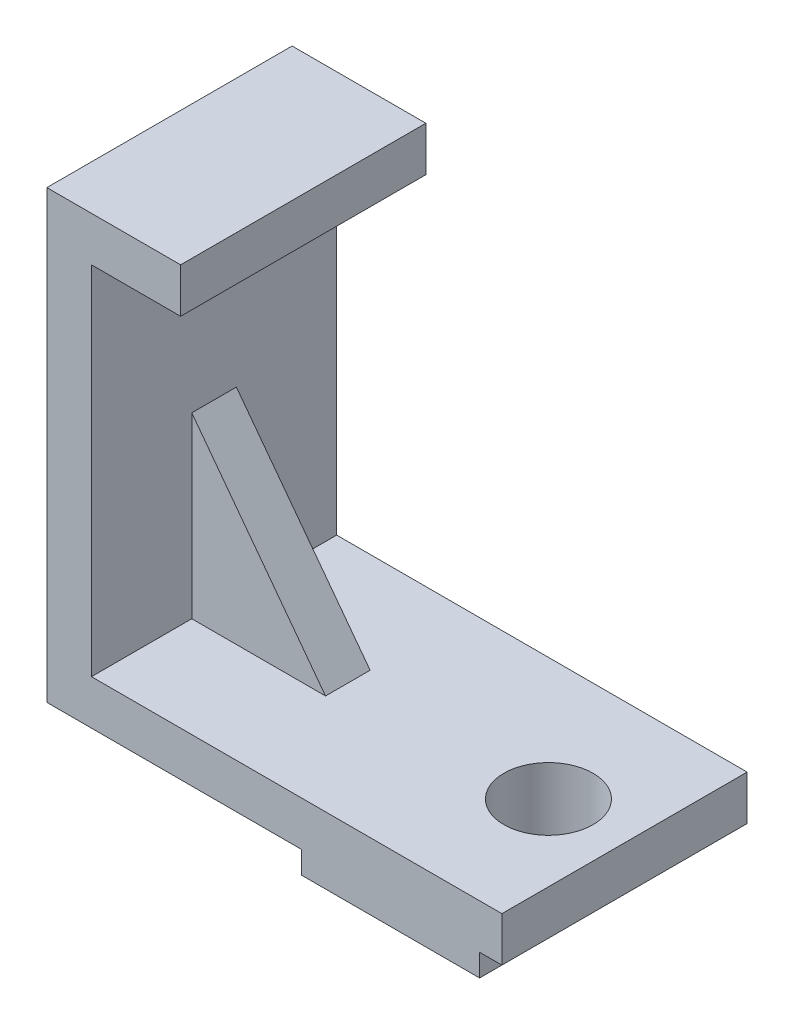
ISO-10303-21;
HEADER;
FILE_DESCRIPTION(('STEP AP214'),'2;1');
FILE_NAME('part.step','',(''),(''),'','','');
FILE_SCHEMA(('AUTOMOTIVE_DESIGN { 1 0 10303 214 1 1 1 1 }'));
ENDSEC;
DATA;
#1=APPLICATION_CONTEXT('core data for automotive mechanical design processes');
#2=APPLICATION_PROTOCOL_DEFINITION('international standard','automotive_design',2000,#1);
#3=PRODUCT_CONTEXT('',#1,'mechanical');
#4=PRODUCT('Part','Part','',(#3));
#5=PRODUCT_RELATED_PRODUCT_CATEGORY('part','',(#4));
#6=PRODUCT_DEFINITION_FORMATION('','',#4);
#7=PRODUCT_DEFINITION_CONTEXT('part definition',#1,'design');
#8=PRODUCT_DEFINITION('design','',#6,#7);
#9=PRODUCT_DEFINITION_SHAPE('','',#8);
#10=(LENGTH_UNIT() NAMED_UNIT(*) SI_UNIT(.MILLI.,.METRE.));
#11=(NAMED_UNIT(*) PLANE_ANGLE_UNIT() SI_UNIT($,.RADIAN.));
#12=(NAMED_UNIT(*) SI_UNIT($,.STERADIAN.) SOLID_ANGLE_UNIT());
#13=UNCERTAINTY_MEASURE_WITH_UNIT(LENGTH_MEASURE(1.E-05),#10,'distance_accuracy_value','');
#14=(GEOMETRIC_REPRESENTATION_CONTEXT(3) GLOBAL_UNCERTAINTY_ASSIGNED_CONTEXT((#13)) GLOBAL_UNIT_ASSIGNED_CONTEXT((#10,
#11,#12)) REPRESENTATION_CONTEXT('',''));
#15=CARTESIAN_POINT('',(0.,0.,0.));
#16=DIRECTION('',(0.,0.,1.));
#17=DIRECTION('',(1.,0.,0.));
#18=AXIS2_PLACEMENT_3D('',#15,#16,#17);
#19=CARTESIAN_POINT('',(-47.0552147239264,21.2576687116564,55.));
#20=DIRECTION('',(0.,1.,0.));
#21=DIRECTION('',(-1.,0.,0.));
#22=AXIS2_PLACEMENT_3D('',#19,#20,#21);
#23=PLANE('',#22);
#24=DIRECTION('',(1.,0.,0.));
#25=VECTOR('',#24,1.);
#26=CARTESIAN_POINT('',(-47.0552147239264,21.2576687116564,0.));
#27=LINE('',#26,#25);
#28=CARTESIAN_POINT('',(-47.0552147239264,21.2576687116564,0.));
#29=VERTEX_POINT('',#28);
#30=CARTESIAN_POINT('',(-27.0552147239264,21.2576687116564,0.));
#31=VERTEX_POINT('',#30);
#32=EDGE_CURVE('E165',#29,#31,#27,.T.);
#33=ORIENTED_EDGE('',*,*,#32,.T.);
#34=DIRECTION('',(0.,0.,-1.));
#35=VECTOR('',#34,1.);
#36=CARTESIAN_POINT('',(-27.0552147239264,21.2576687116564,55.));
#37=LINE('',#36,#35);
#38=CARTESIAN_POINT('',(-27.0552147239264,21.2576687116564,55.));
#39=VERTEX_POINT('',#38);
#40=EDGE_CURVE('E149',#39,#31,#37,.T.);
#41=ORIENTED_EDGE('',*,*,#40,.F.);
#42=DIRECTION('',(1.,0.,0.));
#43=VECTOR('',#42,1.);
#44=CARTESIAN_POINT('',(-47.0552147239264,21.2576687116564,55.));
#45=LINE('',#44,#43);
#46=CARTESIAN_POINT('',(-47.0552147239264,21.2576687116564,55.));
#47=VERTEX_POINT('',#46);
#48=EDGE_CURVE('E166',#47,#39,#45,.T.);
#49=ORIENTED_EDGE('',*,*,#48,.F.);
#50=DIRECTION('',(0.,0.,-1.));
#51=VECTOR('',#50,1.);
#52=CARTESIAN_POINT('',(-47.0552147239264,21.2576687116564,55.));
#53=LINE('',#52,#51);
#54=EDGE_CURVE('E192',#47,#29,#53,.T.);
#55=ORIENTED_EDGE('',*,*,#54,.T.);
#56=EDGE_LOOP('',(#33,#41,#49,#55));
#57=FACE_BOUND('',#56,.T.);
#58=ADVANCED_FACE('F33',(#57),#23,.F.);
#59=CARTESIAN_POINT('',(-27.0552147239264,21.2576687116564,55.));
#60=DIRECTION('',(-1.,0.,0.));
#61=DIRECTION('',(0.,0.,1.));
#62=AXIS2_PLACEMENT_3D('',#59,#60,#61);
#63=PLANE('',#62);
#64=DIRECTION('',(0.,1.,0.));
#65=VECTOR('',#64,1.);
#66=CARTESIAN_POINT('',(-27.0552147239264,21.2576687116564,0.));
#67=LINE('',#66,#65);
#68=CARTESIAN_POINT('',(-27.0552147239264,31.2576687116564,0.));
#69=VERTEX_POINT('',#68);
#70=EDGE_CURVE('E195',#31,#69,#67,.T.);
#71=ORIENTED_EDGE('',*,*,#70,.T.);
#72=DIRECTION('',(0.,0.,-1.));
#73=VECTOR('',#72,1.);
#74=CARTESIAN_POINT('',(-27.0552147239264,31.2576687116564,55.));
#75=LINE('',#74,#73);
#76=CARTESIAN_POINT('',(-27.0552147239264,31.2576687116564,55.));
#77=VERTEX_POINT('',#76);
#78=EDGE_CURVE('E246',#77,#69,#75,.T.);
#79=ORIENTED_EDGE('',*,*,#78,.F.);
#80=DIRECTION('',(0.,1.,0.));
#81=VECTOR('',#80,1.);
#82=CARTESIAN_POINT('',(-27.0552147239264,21.2576687116564,55.));
#83=LINE('',#82,#81);
#84=EDGE_CURVE('E169',#39,#77,#83,.T.);
#85=ORIENTED_EDGE('',*,*,#84,.F.);
#86=ORIENTED_EDGE('',*,*,#40,.T.);
#87=EDGE_LOOP('',(#71,#79,#85,#86));
#88=FACE_BOUND('',#87,.T.);
#89=ADVANCED_FACE('F252',(#88),#63,.F.);
#90=CARTESIAN_POINT('',(-27.0552147239264,31.2576687116564,55.));
#91=DIRECTION('',(0.,-1.,0.));
#92=DIRECTION('',(1.,0.,0.));
#93=AXIS2_PLACEMENT_3D('',#90,#91,#92);
#94=PLANE('',#93);
#95=DIRECTION('',(-1.,0.,0.));
#96=VECTOR('',#95,1.);
#97=CARTESIAN_POINT('',(-27.0552147239264,31.2576687116564,0.));
#98=LINE('',#97,#96);
#99=CARTESIAN_POINT('',(-57.0552147239264,31.2576687116564,0.));
#100=VERTEX_POINT('',#99);
#101=EDGE_CURVE('E197',#69,#100,#98,.T.);
#102=ORIENTED_EDGE('',*,*,#101,.T.);
#103=DIRECTION('',(0.,0.,-1.));
#104=VECTOR('',#103,1.);
#105=CARTESIAN_POINT('',(-57.0552147239264,31.2576687116564,55.));
#106=LINE('',#105,#104);
#107=CARTESIAN_POINT('',(-57.0552147239264,31.2576687116564,55.));
#108=VERTEX_POINT('',#107);
#109=EDGE_CURVE('E243',#108,#100,#106,.T.);
#110=ORIENTED_EDGE('',*,*,#109,.F.);
#111=DIRECTION('',(-1.,0.,0.));
#112=VECTOR('',#111,1.);
#113=CARTESIAN_POINT('',(-27.0552147239264,31.2576687116564,55.));
#114=LINE('',#113,#112);
#115=EDGE_CURVE('E172',#77,#108,#114,.T.);
#116=ORIENTED_EDGE('',*,*,#115,.F.);
#117=ORIENTED_EDGE('',*,*,#78,.T.);
#118=EDGE_LOOP('',(#102,#110,#116,#117));
#119=FACE_BOUND('',#118,.T.);
#120=ADVANCED_FACE('F267',(#119),#94,.F.);
#121=CARTESIAN_POINT('',(-57.0552147239264,31.2576687116564,55.));
#122=DIRECTION('',(1.,0.,0.));
#123=DIRECTION('',(0.,1.,0.));
#124=AXIS2_PLACEMENT_3D('',#121,#122,#123);
#125=PLANE('',#124);
#126=DIRECTION('',(0.,-1.,0.));
#127=VECTOR('',#126,1.);
#128=CARTESIAN_POINT('',(-57.0552147239264,31.2576687116564,0.));
#129=LINE('',#128,#127);
#130=CARTESIAN_POINT('',(-57.0552147239264,-68.7423312883436,0.));
#131=VERTEX_POINT('',#130);
#132=EDGE_CURVE('E199',#100,#131,#129,.T.);
#133=ORIENTED_EDGE('',*,*,#132,.T.);
#134=DIRECTION('',(0.,0.,-1.));
#135=VECTOR('',#134,1.);
#136=CARTESIAN_POINT('',(-57.0552147239264,-68.7423312883436,55.));
#137=LINE('',#136,#135);
#138=CARTESIAN_POINT('',(-57.0552147239264,-68.7423312883436,55.));
#139=VERTEX_POINT('',#138);
#140=EDGE_CURVE('E241',#139,#131,#137,.T.);
#141=ORIENTED_EDGE('',*,*,#140,.F.);
#142=DIRECTION('',(0.,-1.,0.));
#143=VECTOR('',#142,1.);
#144=CARTESIAN_POINT('',(-57.0552147239264,31.2576687116564,55.));
#145=LINE('',#144,#143);
#146=EDGE_CURVE('E174',#108,#139,#145,.T.);
#147=ORIENTED_EDGE('',*,*,#146,.F.);
#148=ORIENTED_EDGE('',*,*,#109,.T.);
#149=EDGE_LOOP('',(#133,#141,#147,#148));
#150=FACE_BOUND('',#149,.T.);
#151=ADVANCED_FACE('F271',(#150),#125,.F.);
#152=CARTESIAN_POINT('',(-57.0552147239264,-68.7423312883436,55.));
#153=DIRECTION('',(0.,1.,0.));
#154=DIRECTION('',(0.,0.,1.));
#155=AXIS2_PLACEMENT_3D('',#152,#153,#154);
#156=PLANE('',#155);
#157=ORIENTED_EDGE('',*,*,#140,.T.);
#158=DIRECTION('',(1.,0.,0.));
#159=VECTOR('',#158,1.);
#160=CARTESIAN_POINT('',(-57.0552147239264,-68.7423312883436,0.));
#161=LINE('',#160,#159);
#162=CARTESIAN_POINT('',(0.,-68.7423312883436,0.));
#163=VERTEX_POINT('',#162);
#164=EDGE_CURVE('E202',#131,#163,#161,.T.);
#165=ORIENTED_EDGE('',*,*,#164,.T.);
#166=DIRECTION('',(0.,0.,-1.));
#167=VECTOR('',#166,1.);
#168=CARTESIAN_POINT('',(0.,-68.7423312883436,55.));
#169=LINE('',#168,#167);
#170=CARTESIAN_POINT('',(0.,-68.7423312883436,55.));
#171=VERTEX_POINT('',#170);
#172=EDGE_CURVE('E238',#171,#163,#169,.T.);
#173=ORIENTED_EDGE('',*,*,#172,.F.);
#174=DIRECTION('',(1.,0.,0.));
#175=VECTOR('',#174,1.);
#176=CARTESIAN_POINT('',(-57.0552147239264,-68.7423312883436,55.));
#177=LINE('',#176,#175);
#178=EDGE_CURVE('E176',#139,#171,#177,.T.);
#179=ORIENTED_EDGE('',*,*,#178,.F.);
#180=EDGE_LOOP('',(#157,#165,#173,#179));
#181=FACE_BOUND('',#180,.T.);
#182=ADVANCED_FACE('F307',(#181),#156,.F.);
#183=CARTESIAN_POINT('',(0.,-68.7423312883436,55.));
#184=DIRECTION('',(1.,0.,0.));
#185=DIRECTION('',(0.,1.,0.));
#186=AXIS2_PLACEMENT_3D('',#183,#184,#185);
#187=PLANE('',#186);
#188=DIRECTION('',(0.,-1.,0.));
#189=VECTOR('',#188,1.);
#190=CARTESIAN_POINT('',(0.,-68.7423312883436,0.));
#191=LINE('',#190,#189);
#192=CARTESIAN_POINT('',(0.,-73.7423312883436,0.));
#193=VERTEX_POINT('',#192);
#194=EDGE_CURVE('E204',#163,#193,#191,.T.);
#195=ORIENTED_EDGE('',*,*,#194,.T.);
#196=DIRECTION('',(0.,0.,-1.));
#197=VECTOR('',#196,1.);
#198=CARTESIAN_POINT('',(0.,-73.7423312883436,55.));
#199=LINE('',#198,#197);
#200=CARTESIAN_POINT('',(0.,-73.7423312883436,55.));
#201=VERTEX_POINT('',#200);
#202=EDGE_CURVE('E235',#201,#193,#199,.T.);
#203=ORIENTED_EDGE('',*,*,#202,.F.);
#204=DIRECTION('',(0.,-1.,0.));
#205=VECTOR('',#204,1.);
#206=CARTESIAN_POINT('',(0.,-68.7423312883436,55.));
#207=LINE('',#206,#205);
#208=EDGE_CURVE('E178',#171,#201,#207,.T.);
#209=ORIENTED_EDGE('',*,*,#208,.F.);
#210=ORIENTED_EDGE('',*,*,#172,.T.);
#211=EDGE_LOOP('',(#195,#203,#209,#210));
#212=FACE_BOUND('',#211,.T.);
#213=ADVANCED_FACE('F305',(#212),#187,.F.);
#214=CARTESIAN_POINT('',(0.,-73.7423312883436,55.));
#215=DIRECTION('',(0.,1.,0.));
#216=DIRECTION('',(0.,0.,1.));
#217=AXIS2_PLACEMENT_3D('',#214,#215,#216);
#218=PLANE('',#217);
#219=CARTESIAN_POINT('',(27.9447852760736,-73.7423312883436,27.5));
#220=DIRECTION('',(0.,1.,0.));
#221=DIRECTION('',(-1.,0.,0.));
#222=AXIS2_PLACEMENT_3D('',#219,#220,#221);
#223=CIRCLE('',#222,10.);
#224=CARTESIAN_POINT('',(17.9447852760736,-73.7423312883436,27.5));
#225=VERTEX_POINT('',#224);
#226=EDGE_CURVE('E153',#225,#225,#223,.T.);
#227=ORIENTED_EDGE('',*,*,#226,.T.);
#228=EDGE_LOOP('',(#227));
#229=FACE_BOUND('',#228,.T.);
#230=DIRECTION('',(1.,0.,0.));
#231=VECTOR('',#230,1.);
#232=CARTESIAN_POINT('',(0.,-73.7423312883436,0.));
#233=LINE('',#232,#231);
#234=CARTESIAN_POINT('',(40.,-73.7423312883436,0.));
#235=VERTEX_POINT('',#234);
#236=EDGE_CURVE('E206',#193,#235,#233,.T.);
#237=ORIENTED_EDGE('',*,*,#236,.T.);
#238=DIRECTION('',(0.,0.,-1.));
#239=VECTOR('',#238,1.);
#240=CARTESIAN_POINT('',(40.,-73.7423312883436,55.));
#241=LINE('',#240,#239);
#242=CARTESIAN_POINT('',(40.,-73.7423312883436,55.));
#243=VERTEX_POINT('',#242);
#244=EDGE_CURVE('E232',#243,#235,#241,.T.);
#245=ORIENTED_EDGE('',*,*,#244,.F.);
#246=DIRECTION('',(1.,0.,0.));
#247=VECTOR('',#246,1.);
#248=CARTESIAN_POINT('',(0.,-73.7423312883436,55.));
#249=LINE('',#248,#247);
#250=EDGE_CURVE('E180',#201,#243,#249,.T.);
#251=ORIENTED_EDGE('',*,*,#250,.F.);
#252=ORIENTED_EDGE('',*,*,#202,.T.);
#253=EDGE_LOOP('',(#237,#245,#251,#252));
#254=FACE_BOUND('',#253,.T.);
#255=ADVANCED_FACE('F300',(#229,#254),#218,.F.);
#256=CARTESIAN_POINT('',(40.,-73.7423312883436,55.));
#257=DIRECTION('',(-1.,0.,0.));
#258=DIRECTION('',(0.,0.,1.));
#259=AXIS2_PLACEMENT_3D('',#256,#257,#258);
#260=PLANE('',#259);
#261=DIRECTION('',(0.,1.,0.));
#262=VECTOR('',#261,1.);
#263=CARTESIAN_POINT('',(40.,-73.7423312883436,0.));
#264=LINE('',#263,#262);
#265=CARTESIAN_POINT('',(40.,-68.7423312883436,0.));
#266=VERTEX_POINT('',#265);
#267=EDGE_CURVE('E208',#235,#266,#264,.T.);
#268=ORIENTED_EDGE('',*,*,#267,.T.);
#269=DIRECTION('',(0.,0.,-1.));
#270=VECTOR('',#269,1.);
#271=CARTESIAN_POINT('',(40.,-68.7423312883436,55.));
#272=LINE('',#271,#270);
#273=CARTESIAN_POINT('',(40.,-68.7423312883436,55.));
#274=VERTEX_POINT('',#273);
#275=EDGE_CURVE('E229',#274,#266,#272,.T.);
#276=ORIENTED_EDGE('',*,*,#275,.F.);
#277=DIRECTION('',(0.,1.,0.));
#278=VECTOR('',#277,1.);
#279=CARTESIAN_POINT('',(40.,-73.7423312883436,55.));
#280=LINE('',#279,#278);
#281=EDGE_CURVE('E182',#243,#274,#280,.T.);
#282=ORIENTED_EDGE('',*,*,#281,.F.);
#283=ORIENTED_EDGE('',*,*,#244,.T.);
#284=EDGE_LOOP('',(#268,#276,#282,#283));
#285=FACE_BOUND('',#284,.T.);
#286=ADVANCED_FACE('F295',(#285),#260,.F.);
#287=CARTESIAN_POINT('',(40.,-68.7423312883436,55.));
#288=DIRECTION('',(0.,1.,0.));
#289=DIRECTION('',(0.,0.,1.));
#290=AXIS2_PLACEMENT_3D('',#287,#288,#289);
#291=PLANE('',#290);
#292=DIRECTION('',(1.,0.,0.));
#293=VECTOR('',#292,1.);
#294=CARTESIAN_POINT('',(40.,-68.7423312883436,0.));
#295=LINE('',#294,#293);
#296=CARTESIAN_POINT('',(45.,-68.7423312883436,0.));
#297=VERTEX_POINT('',#296);
#298=EDGE_CURVE('E210',#266,#297,#295,.T.);
#299=ORIENTED_EDGE('',*,*,#298,.T.);
#300=DIRECTION('',(0.,0.,-1.));
#301=VECTOR('',#300,1.);
#302=CARTESIAN_POINT('',(45.,-68.7423312883436,55.));
#303=LINE('',#302,#301);
#304=CARTESIAN_POINT('',(45.,-68.7423312883436,55.));
#305=VERTEX_POINT('',#304);
#306=EDGE_CURVE('E226',#305,#297,#303,.T.);
#307=ORIENTED_EDGE('',*,*,#306,.F.);
#308=DIRECTION('',(1.,0.,0.));
#309=VECTOR('',#308,1.);
#310=CARTESIAN_POINT('',(40.,-68.7423312883436,55.));
#311=LINE('',#310,#309);
#312=EDGE_CURVE('E184',#274,#305,#311,.T.);
#313=ORIENTED_EDGE('',*,*,#312,.F.);
#314=ORIENTED_EDGE('',*,*,#275,.T.);
#315=EDGE_LOOP('',(#299,#307,#313,#314));
#316=FACE_BOUND('',#315,.T.);
#317=ADVANCED_FACE('F291',(#316),#291,.F.);
#318=CARTESIAN_POINT('',(45.,-68.7423312883436,55.));
#319=DIRECTION('',(-1.,0.,0.));
#320=DIRECTION('',(0.,0.,1.));
#321=AXIS2_PLACEMENT_3D('',#318,#319,#320);
#322=PLANE('',#321);
#323=DIRECTION('',(0.,1.,0.));
#324=VECTOR('',#323,1.);
#325=CARTESIAN_POINT('',(45.,-68.7423312883436,0.));
#326=LINE('',#325,#324);
#327=CARTESIAN_POINT('',(45.,-58.7423312883436,0.));
#328=VERTEX_POINT('',#327);
#329=EDGE_CURVE('E212',#297,#328,#326,.T.);
#330=ORIENTED_EDGE('',*,*,#329,.T.);
#331=DIRECTION('',(0.,0.,-1.));
#332=VECTOR('',#331,1.);
#333=CARTESIAN_POINT('',(45.,-58.7423312883436,55.));
#334=LINE('',#333,#332);
#335=CARTESIAN_POINT('',(45.,-58.7423312883436,55.));
#336=VERTEX_POINT('',#335);
#337=EDGE_CURVE('E223',#336,#328,#334,.T.);
#338=ORIENTED_EDGE('',*,*,#337,.F.);
#339=DIRECTION('',(0.,1.,0.));
#340=VECTOR('',#339,1.);
#341=CARTESIAN_POINT('',(45.,-68.7423312883436,55.));
#342=LINE('',#341,#340);
#343=EDGE_CURVE('E186',#305,#336,#342,.T.);
#344=ORIENTED_EDGE('',*,*,#343,.F.);
#345=ORIENTED_EDGE('',*,*,#306,.T.);
#346=EDGE_LOOP('',(#330,#338,#344,#345));
#347=FACE_BOUND('',#346,.T.);
#348=ADVANCED_FACE('F286',(#347),#322,.F.);
#349=CARTESIAN_POINT('',(45.,-58.7423312883436,55.));
#350=DIRECTION('',(0.,-1.,0.));
#351=DIRECTION('',(1.,0.,0.));
#352=AXIS2_PLACEMENT_3D('',#349,#350,#351);
#353=PLANE('',#352);
#354=CARTESIAN_POINT('',(27.9447852760736,-58.7423312883436,27.5));
#355=DIRECTION('',(0.,1.,0.));
#356=DIRECTION('',(-1.,0.,0.));
#357=AXIS2_PLACEMENT_3D('',#354,#355,#356);
#358=CIRCLE('',#357,10.);
#359=CARTESIAN_POINT('',(17.9447852760736,-58.7423312883436,27.5));
#360=VERTEX_POINT('',#359);
#361=EDGE_CURVE('E157',#360,#360,#358,.T.);
#362=ORIENTED_EDGE('',*,*,#361,.F.);
#363=EDGE_LOOP('',(#362));
#364=FACE_BOUND('',#363,.T.);
#365=DIRECTION('',(0.,0.,-1.));
#366=VECTOR('',#365,1.);
#367=CARTESIAN_POINT('',(-17.0552147239264,-58.7423312883436,55.));
#368=LINE('',#367,#366);
#369=CARTESIAN_POINT('',(-17.0552147239264,-58.7423312883436,22.5));
#370=VERTEX_POINT('',#369);
#371=CARTESIAN_POINT('',(-17.0552147239264,-58.7423312883436,32.5));
#372=VERTEX_POINT('',#371);
#373=EDGE_CURVE('E47',#370,#372,#368,.F.);
#374=ORIENTED_EDGE('',*,*,#373,.T.);
#375=DIRECTION('',(-1.,0.,0.));
#376=VECTOR('',#375,1.);
#377=CARTESIAN_POINT('',(45.,-58.7423312883436,32.5));
#378=LINE('',#377,#376);
#379=CARTESIAN_POINT('',(-47.0552147239264,-58.7423312883436,32.5));
#380=VERTEX_POINT('',#379);
#381=EDGE_CURVE('E162',#372,#380,#378,.T.);
#382=ORIENTED_EDGE('',*,*,#381,.T.);
#383=DIRECTION('',(0.,0.,-1.));
#384=VECTOR('',#383,1.);
#385=CARTESIAN_POINT('',(-47.0552147239264,-58.7423312883436,55.));
#386=LINE('',#385,#384);
#387=CARTESIAN_POINT('',(-47.0552147239264,-58.7423312883436,55.));
#388=VERTEX_POINT('',#387);
#389=EDGE_CURVE('E221',#388,#380,#386,.T.);
#390=ORIENTED_EDGE('',*,*,#389,.F.);
#391=DIRECTION('',(-1.,0.,0.));
#392=VECTOR('',#391,1.);
#393=CARTESIAN_POINT('',(45.,-58.7423312883436,55.));
#394=LINE('',#393,#392);
#395=EDGE_CURVE('E188',#336,#388,#394,.T.);
#396=ORIENTED_EDGE('',*,*,#395,.F.);
#397=ORIENTED_EDGE('',*,*,#337,.T.);
#398=DIRECTION('',(-1.,0.,0.));
#399=VECTOR('',#398,1.);
#400=CARTESIAN_POINT('',(45.,-58.7423312883436,0.));
#401=LINE('',#400,#399);
#402=CARTESIAN_POINT('',(-47.0552147239264,-58.7423312883436,0.));
#403=VERTEX_POINT('',#402);
#404=EDGE_CURVE('E214',#328,#403,#401,.T.);
#405=ORIENTED_EDGE('',*,*,#404,.T.);
#406=CARTESIAN_POINT('',(-47.0552147239264,-58.7423312883436,22.5));
#407=VERTEX_POINT('',#406);
#408=EDGE_CURVE('E220',#407,#403,#386,.T.);
#409=ORIENTED_EDGE('',*,*,#408,.F.);
#410=DIRECTION('',(-1.,0.,0.));
#411=VECTOR('',#410,1.);
#412=CARTESIAN_POINT('',(45.,-58.7423312883436,22.5));
#413=LINE('',#412,#411);
#414=EDGE_CURVE('E52',#370,#407,#413,.T.);
#415=ORIENTED_EDGE('',*,*,#414,.F.);
#416=EDGE_LOOP('',(#374,#382,#390,#396,#397,#405,#409,#415));
#417=FACE_BOUND('',#416,.T.);
#418=ADVANCED_FACE('F280',(#364,#417),#353,.F.);
#419=CARTESIAN_POINT('',(-47.0552147239264,-58.7423312883436,55.));
#420=DIRECTION('',(-1.,0.,0.));
#421=DIRECTION('',(0.,0.,1.));
#422=AXIS2_PLACEMENT_3D('',#419,#420,#421);
#423=PLANE('',#422);
#424=ORIENTED_EDGE('',*,*,#389,.T.);
#425=DIRECTION('',(0.,1.,0.));
#426=VECTOR('',#425,1.);
#427=CARTESIAN_POINT('',(-47.0552147239264,-58.7423312883436,32.5));
#428=LINE('',#427,#426);
#429=CARTESIAN_POINT('',(-47.0552147239264,-18.7423312883436,32.5));
#430=VERTEX_POINT('',#429);
#431=EDGE_CURVE('E11',#380,#430,#428,.T.);
#432=ORIENTED_EDGE('',*,*,#431,.T.);
#433=DIRECTION('',(0.,0.,1.));
#434=VECTOR('',#433,1.);
#435=CARTESIAN_POINT('',(-47.0552147239264,-18.7423312883436,55.));
#436=LINE('',#435,#434);
#437=CARTESIAN_POINT('',(-47.0552147239264,-18.7423312883436,22.5));
#438=VERTEX_POINT('',#437);
#439=EDGE_CURVE('E40',#430,#438,#436,.F.);
#440=ORIENTED_EDGE('',*,*,#439,.T.);
#441=DIRECTION('',(0.,1.,0.));
#442=VECTOR('',#441,1.);
#443=CARTESIAN_POINT('',(-47.0552147239264,-58.7423312883436,22.5));
#444=LINE('',#443,#442);
#445=EDGE_CURVE('E139',#407,#438,#444,.T.);
#446=ORIENTED_EDGE('',*,*,#445,.F.);
#447=ORIENTED_EDGE('',*,*,#408,.T.);
#448=DIRECTION('',(0.,1.,0.));
#449=VECTOR('',#448,1.);
#450=CARTESIAN_POINT('',(-47.0552147239264,-58.7423312883436,0.));
#451=LINE('',#450,#449);
#452=EDGE_CURVE('E170',#403,#29,#451,.T.);
#453=ORIENTED_EDGE('',*,*,#452,.T.);
#454=ORIENTED_EDGE('',*,*,#54,.F.);
#455=DIRECTION('',(0.,1.,0.));
#456=VECTOR('',#455,1.);
#457=CARTESIAN_POINT('',(-47.0552147239264,-58.7423312883436,55.));
#458=LINE('',#457,#456);
#459=EDGE_CURVE('E190',#388,#47,#458,.T.);
#460=ORIENTED_EDGE('',*,*,#459,.F.);
#461=EDGE_LOOP('',(#424,#432,#440,#446,#447,#453,#454,#460));
#462=FACE_BOUND('',#461,.T.);
#463=ADVANCED_FACE('F138',(#462),#423,.F.);
#464=CARTESIAN_POINT('',(0.,0.,55.));
#465=DIRECTION('',(0.,0.,1.));
#466=DIRECTION('',(1.,0.,0.));
#467=AXIS2_PLACEMENT_3D('',#464,#465,#466);
#468=PLANE('',#467);
#469=ORIENTED_EDGE('',*,*,#48,.T.);
#470=ORIENTED_EDGE('',*,*,#84,.T.);
#471=ORIENTED_EDGE('',*,*,#115,.T.);
#472=ORIENTED_EDGE('',*,*,#146,.T.);
#473=ORIENTED_EDGE('',*,*,#178,.T.);
#474=ORIENTED_EDGE('',*,*,#208,.T.);
#475=ORIENTED_EDGE('',*,*,#250,.T.);
#476=ORIENTED_EDGE('',*,*,#281,.T.);
#477=ORIENTED_EDGE('',*,*,#312,.T.);
#478=ORIENTED_EDGE('',*,*,#343,.T.);
#479=ORIENTED_EDGE('',*,*,#395,.T.);
#480=ORIENTED_EDGE('',*,*,#459,.T.);
#481=EDGE_LOOP('',(#469,#470,#471,#472,#473,#474,#475,#476,#477,#478,#479,#480));
#482=FACE_BOUND('',#481,.T.);
#483=ADVANCED_FACE('F275',(#482),#468,.T.);
#484=CARTESIAN_POINT('',(0.,0.,0.));
#485=DIRECTION('',(0.,0.,1.));
#486=DIRECTION('',(1.,0.,0.));
#487=AXIS2_PLACEMENT_3D('',#484,#485,#486);
#488=PLANE('',#487);
#489=ORIENTED_EDGE('',*,*,#32,.F.);
#490=ORIENTED_EDGE('',*,*,#452,.F.);
#491=ORIENTED_EDGE('',*,*,#404,.F.);
#492=ORIENTED_EDGE('',*,*,#329,.F.);
#493=ORIENTED_EDGE('',*,*,#298,.F.);
#494=ORIENTED_EDGE('',*,*,#267,.F.);
#495=ORIENTED_EDGE('',*,*,#236,.F.);
#496=ORIENTED_EDGE('',*,*,#194,.F.);
#497=ORIENTED_EDGE('',*,*,#164,.F.);
#498=ORIENTED_EDGE('',*,*,#132,.F.);
#499=ORIENTED_EDGE('',*,*,#101,.F.);
#500=ORIENTED_EDGE('',*,*,#70,.F.);
#501=EDGE_LOOP('',(#489,#490,#491,#492,#493,#494,#495,#496,#497,#498,#499,#500));
#502=FACE_BOUND('',#501,.T.);
#503=ADVANCED_FACE('F260',(#502),#488,.F.);
#504=CARTESIAN_POINT('',(-47.0552147239264,-18.7423312883436,27.5));
#505=DIRECTION('',(-0.8,-0.6,0.));
#506=DIRECTION('',(0.6,-0.8,0.));
#507=AXIS2_PLACEMENT_3D('',#504,#505,#506);
#508=PLANE('',#507);
#509=ORIENTED_EDGE('',*,*,#373,.F.);
#510=DIRECTION('',(0.6,-0.8,0.));
#511=VECTOR('',#510,1.);
#512=CARTESIAN_POINT('',(-47.0552147239264,-18.7423312883436,22.5));
#513=LINE('',#512,#511);
#514=EDGE_CURVE('E148',#438,#370,#513,.T.);
#515=ORIENTED_EDGE('',*,*,#514,.F.);
#516=ORIENTED_EDGE('',*,*,#439,.F.);
#517=DIRECTION('',(0.6,-0.8,0.));
#518=VECTOR('',#517,1.);
#519=CARTESIAN_POINT('',(-47.0552147239264,-18.7423312883436,32.5));
#520=LINE('',#519,#518);
#521=EDGE_CURVE('E152',#430,#372,#520,.T.);
#522=ORIENTED_EDGE('',*,*,#521,.T.);
#523=EDGE_LOOP('',(#509,#515,#516,#522));
#524=FACE_BOUND('',#523,.T.);
#525=ADVANCED_FACE('F151',(#524),#508,.F.);
#526=CARTESIAN_POINT('',(-6.02760736196322,-21.2423312883436,32.5));
#527=DIRECTION('',(0.,0.,1.));
#528=DIRECTION('',(1.,0.,0.));
#529=AXIS2_PLACEMENT_3D('',#526,#527,#528);
#530=PLANE('',#529);
#531=ORIENTED_EDGE('',*,*,#381,.F.);
#532=ORIENTED_EDGE('',*,*,#521,.F.);
#533=ORIENTED_EDGE('',*,*,#431,.F.);
#534=EDGE_LOOP('',(#531,#532,#533));
#535=FACE_BOUND('',#534,.T.);
#536=ADVANCED_FACE('F362',(#535),#530,.T.);
#537=CARTESIAN_POINT('',(-6.02760736196322,-21.2423312883436,22.5));
#538=DIRECTION('',(0.,0.,1.));
#539=DIRECTION('',(1.,0.,0.));
#540=AXIS2_PLACEMENT_3D('',#537,#538,#539);
#541=PLANE('',#540);
#542=ORIENTED_EDGE('',*,*,#514,.T.);
#543=ORIENTED_EDGE('',*,*,#414,.T.);
#544=ORIENTED_EDGE('',*,*,#445,.T.);
#545=EDGE_LOOP('',(#542,#543,#544));
#546=FACE_BOUND('',#545,.T.);
#547=ADVANCED_FACE('F147',(#546),#541,.F.);
#548=CARTESIAN_POINT('',(27.9447852760736,-73.7423312883436,27.5));
#549=DIRECTION('',(0.,1.,0.));
#550=DIRECTION('',(-1.,0.,0.));
#551=AXIS2_PLACEMENT_3D('',#548,#549,#550);
#552=CYLINDRICAL_SURFACE('',#551,10.);
#553=CARTESIAN_POINT('',(17.9447852760736,-73.7423312883436,27.5));
#554=CARTESIAN_POINT('',(17.9447852760736,-73.5860812883436,27.5));
#555=CARTESIAN_POINT('',(17.9447852760736,-73.4298312883436,27.5));
#556=CARTESIAN_POINT('',(17.9447852760736,-73.1173312883436,27.5));
#557=CARTESIAN_POINT('',(17.9447852760736,-72.9610812883436,27.5));
#558=CARTESIAN_POINT('',(17.9447852760736,-72.6485812883436,27.5));
#559=CARTESIAN_POINT('',(17.9447852760736,-72.4923312883436,27.5));
#560=CARTESIAN_POINT('',(17.9447852760736,-72.1798312883436,27.5));
#561=CARTESIAN_POINT('',(17.9447852760736,-72.0235812883436,27.5));
#562=CARTESIAN_POINT('',(17.9447852760736,-71.7110812883436,27.5));
#563=CARTESIAN_POINT('',(17.9447852760736,-71.5548312883436,27.5));
#564=CARTESIAN_POINT('',(17.9447852760736,-71.2423312883436,27.5));
#565=CARTESIAN_POINT('',(17.9447852760736,-71.0860812883436,27.5));
#566=CARTESIAN_POINT('',(17.9447852760736,-70.7735812883436,27.5));
#567=CARTESIAN_POINT('',(17.9447852760736,-70.6173312883436,27.5));
#568=CARTESIAN_POINT('',(17.9447852760736,-70.3048312883436,27.5));
#569=CARTESIAN_POINT('',(17.9447852760736,-70.1485812883436,27.5));
#570=CARTESIAN_POINT('',(17.9447852760736,-69.8360812883436,27.5));
#571=CARTESIAN_POINT('',(17.9447852760736,-69.6798312883436,27.5));
#572=CARTESIAN_POINT('',(17.9447852760736,-69.3673312883436,27.5));
#573=CARTESIAN_POINT('',(17.9447852760736,-69.2110812883436,27.5));
#574=CARTESIAN_POINT('',(17.9447852760736,-68.8985812883436,27.5));
#575=CARTESIAN_POINT('',(17.9447852760736,-68.7423312883436,27.5));
#576=CARTESIAN_POINT('',(17.9447852760736,-68.4298312883436,27.5));
#577=CARTESIAN_POINT('',(17.9447852760736,-68.2735812883436,27.5));
#578=CARTESIAN_POINT('',(17.9447852760736,-67.9610812883436,27.5));
#579=CARTESIAN_POINT('',(17.9447852760736,-67.8048312883436,27.5));
#580=CARTESIAN_POINT('',(17.9447852760736,-67.4923312883436,27.5));
#581=CARTESIAN_POINT('',(17.9447852760736,-67.3360812883436,27.5));
#582=CARTESIAN_POINT('',(17.9447852760736,-67.0235812883436,27.5));
#583=CARTESIAN_POINT('',(17.9447852760736,-66.8673312883436,27.5));
#584=CARTESIAN_POINT('',(17.9447852760736,-66.5548312883436,27.5));
#585=CARTESIAN_POINT('',(17.9447852760736,-66.3985812883436,27.5));
#586=CARTESIAN_POINT('',(17.9447852760736,-66.0860812883436,27.5));
#587=CARTESIAN_POINT('',(17.9447852760736,-65.9298312883436,27.5));
#588=CARTESIAN_POINT('',(17.9447852760736,-65.6173312883436,27.5));
#589=CARTESIAN_POINT('',(17.9447852760736,-65.4610812883436,27.5));
#590=CARTESIAN_POINT('',(17.9447852760736,-65.1485812883436,27.5));
#591=CARTESIAN_POINT('',(17.9447852760736,-64.9923312883436,27.5));
#592=CARTESIAN_POINT('',(17.9447852760736,-64.6798312883436,27.5));
#593=CARTESIAN_POINT('',(17.9447852760736,-64.5235812883436,27.5));
#594=CARTESIAN_POINT('',(17.9447852760736,-64.2110812883436,27.5));
#595=CARTESIAN_POINT('',(17.9447852760736,-64.0548312883436,27.5));
#596=CARTESIAN_POINT('',(17.9447852760736,-63.7423312883436,27.5));
#597=CARTESIAN_POINT('',(17.9447852760736,-63.5860812883436,27.5));
#598=CARTESIAN_POINT('',(17.9447852760736,-63.2735812883436,27.5));
#599=CARTESIAN_POINT('',(17.9447852760736,-63.1173312883436,27.5));
#600=CARTESIAN_POINT('',(17.9447852760736,-62.8048312883436,27.5));
#601=CARTESIAN_POINT('',(17.9447852760736,-62.6485812883436,27.5));
#602=CARTESIAN_POINT('',(17.9447852760736,-62.3360812883436,27.5));
#603=CARTESIAN_POINT('',(17.9447852760736,-62.1798312883436,27.5));
#604=CARTESIAN_POINT('',(17.9447852760736,-61.8673312883436,27.5));
#605=CARTESIAN_POINT('',(17.9447852760736,-61.7110812883436,27.5));
#606=CARTESIAN_POINT('',(17.9447852760736,-61.3985812883436,27.5));
#607=CARTESIAN_POINT('',(17.9447852760736,-61.2423312883436,27.5));
#608=CARTESIAN_POINT('',(17.9447852760736,-60.9298312883436,27.5));
#609=CARTESIAN_POINT('',(17.9447852760736,-60.7735812883436,27.5));
#610=CARTESIAN_POINT('',(17.9447852760736,-60.4610812883436,27.5));
#611=CARTESIAN_POINT('',(17.9447852760736,-60.3048312883436,27.5));
#612=CARTESIAN_POINT('',(17.9447852760736,-59.9923312883436,27.5));
#613=CARTESIAN_POINT('',(17.9447852760736,-59.8360812883436,27.5));
#614=CARTESIAN_POINT('',(17.9447852760736,-59.5235812883436,27.5));
#615=CARTESIAN_POINT('',(17.9447852760736,-59.3673312883436,27.5));
#616=CARTESIAN_POINT('',(17.9447852760736,-59.0548312883436,27.5));
#617=CARTESIAN_POINT('',(17.9447852760736,-58.8985812883436,27.5));
#618=CARTESIAN_POINT('',(17.9447852760736,-58.7423312883436,27.5));
#619=B_SPLINE_CURVE_WITH_KNOTS('',3,(#553,#554,#555,#556,#557,#558,#559,#560,#561,#562,#563,
#564,#565,#566,#567,#568,#569,#570,#571,#572,#573,#574,#575,#576,#577,#578,#579,#580,#581,#582,
#583,#584,#585,#586,#587,#588,#589,#590,#591,#592,#593,#594,#595,#596,#597,#598,#599,#600,#601,
#602,#603,#604,#605,#606,#607,#608,#609,#610,#611,#612,#613,#614,#615,#616,#617,#618),
.UNSPECIFIED.,.F.,.F.,(4,2,2,2,2,2,2,2,2,2,2,2,2,2,2,2,2,2,2,2,2,2,2,2,2,2,2,2,2,2,2,2,4),(0.,
0.46874999999999,0.937499999999994,1.40625,1.87499999999999,2.34374999999999,2.8125,
3.28124999999999,3.74999999999999,4.21874999999999,4.6875,5.15624999999999,5.62499999999999,
6.09374999999999,6.5625,7.03124999999999,7.49999999999999,7.96875,8.43749999999999,
8.90624999999999,9.37499999999999,9.84374999999998,10.3125,10.78125,11.25,11.71875,12.1875,
12.65625,13.125,13.59375,14.0625,14.53125,15.),.UNSPECIFIED.);
#620=EDGE_CURVE('BSEAM380',#225,#360,#619,.T.);
#621=ORIENTED_EDGE('',*,*,#226,.F.);
#622=ORIENTED_EDGE('',*,*,#361,.T.);
#623=ORIENTED_EDGE('',*,*,#620,.T.);
#624=ORIENTED_EDGE('',*,*,#620,.F.);
#625=EDGE_LOOP('',(#621,#623,#622,#624));
#626=FACE_BOUND('',#625,.T.);
#627=ADVANCED_FACE('F380',(#626),#552,.F.);
#628=CLOSED_SHELL('',(#58,#89,#120,#151,#182,#213,#255,#286,#317,#348,#418,#463,#483,#503,#525,
#536,#547,#627));
#629=MANIFOLD_SOLID_BREP('B2',#628);
#630=ADVANCED_BREP_SHAPE_REPRESENTATION('',(#18,#629),#14);
#631=SHAPE_DEFINITION_REPRESENTATION(#9,#630);
ENDSEC;
END-ISO-10303-21;
